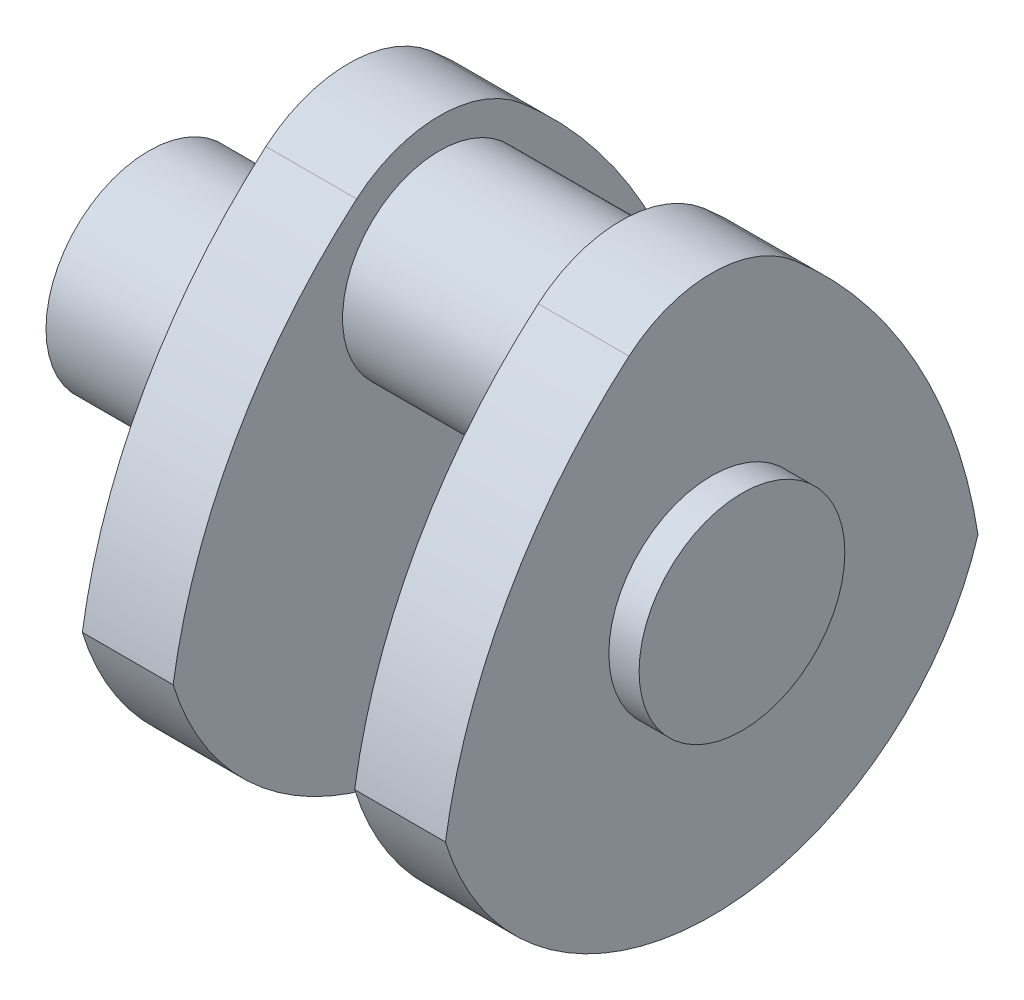
ISO-10303-21;
HEADER;
FILE_DESCRIPTION(('STEP AP214'),'2;1');
FILE_NAME('part.step','',(''),(''),'','','');
FILE_SCHEMA(('AUTOMOTIVE_DESIGN { 1 0 10303 214 1 1 1 1 }'));
ENDSEC;
DATA;
#1=APPLICATION_CONTEXT('core data for automotive mechanical design processes');
#2=APPLICATION_PROTOCOL_DEFINITION('international standard','automotive_design',2000,#1);
#3=PRODUCT_CONTEXT('',#1,'mechanical');
#4=PRODUCT('Part','Part','',(#3));
#5=PRODUCT_RELATED_PRODUCT_CATEGORY('part','',(#4));
#6=PRODUCT_DEFINITION_FORMATION('','',#4);
#7=PRODUCT_DEFINITION_CONTEXT('part definition',#1,'design');
#8=PRODUCT_DEFINITION('design','',#6,#7);
#9=PRODUCT_DEFINITION_SHAPE('','',#8);
#10=(LENGTH_UNIT() NAMED_UNIT(*) SI_UNIT(.MILLI.,.METRE.));
#11=(NAMED_UNIT(*) PLANE_ANGLE_UNIT() SI_UNIT($,.RADIAN.));
#12=(NAMED_UNIT(*) SI_UNIT($,.STERADIAN.) SOLID_ANGLE_UNIT());
#13=UNCERTAINTY_MEASURE_WITH_UNIT(LENGTH_MEASURE(1.E-05),#10,'distance_accuracy_value','');
#14=(GEOMETRIC_REPRESENTATION_CONTEXT(3) GLOBAL_UNCERTAINTY_ASSIGNED_CONTEXT((#13)) GLOBAL_UNIT_ASSIGNED_CONTEXT((#10,
#11,#12)) REPRESENTATION_CONTEXT('',''));
#15=CARTESIAN_POINT('',(0.,0.,0.));
#16=DIRECTION('',(0.,0.,1.));
#17=DIRECTION('',(1.,0.,0.));
#18=AXIS2_PLACEMENT_3D('',#15,#16,#17);
#19=CARTESIAN_POINT('',(-25.,0.,0.));
#20=DIRECTION('',(1.,0.,0.));
#21=DIRECTION('',(0.,0.,-1.));
#22=AXIS2_PLACEMENT_3D('',#19,#20,#21);
#23=CYLINDRICAL_SURFACE('',#22,17.);
#24=CARTESIAN_POINT('',(-25.,0.,0.));
#25=DIRECTION('',(1.,0.,0.));
#26=DIRECTION('',(0.,0.,-1.));
#27=AXIS2_PLACEMENT_3D('',#24,#25,#26);
#28=CIRCLE('',#27,17.);
#29=CARTESIAN_POINT('',(-25.,0.,-17.));
#30=VERTEX_POINT('',#29);
#31=EDGE_CURVE('E55',#30,#30,#28,.T.);
#32=ORIENTED_EDGE('',*,*,#31,.T.);
#33=EDGE_LOOP('',(#32));
#34=FACE_BOUND('',#33,.T.);
#35=CARTESIAN_POINT('',(0.,0.,0.));
#36=DIRECTION('',(1.,0.,0.));
#37=DIRECTION('',(0.,0.,-1.));
#38=AXIS2_PLACEMENT_3D('',#35,#36,#37);
#39=CIRCLE('',#38,17.);
#40=CARTESIAN_POINT('',(0.,0.,-17.));
#41=VERTEX_POINT('',#40);
#42=EDGE_CURVE('E48',#41,#41,#39,.T.);
#43=ORIENTED_EDGE('',*,*,#42,.F.);
#44=EDGE_LOOP('',(#43));
#45=FACE_BOUND('',#44,.T.);
#46=ADVANCED_FACE('F45',(#34,#45),#23,.T.);
#47=CARTESIAN_POINT('',(-25.,0.,0.));
#48=DIRECTION('',(1.,0.,0.));
#49=DIRECTION('',(0.,0.,-1.));
#50=AXIS2_PLACEMENT_3D('',#47,#48,#49);
#51=PLANE('',#50);
#52=ORIENTED_EDGE('',*,*,#31,.F.);
#53=EDGE_LOOP('',(#52));
#54=FACE_BOUND('',#53,.T.);
#55=ADVANCED_FACE('F239',(#54),#51,.F.);
#56=CARTESIAN_POINT('',(8.,0.,0.));
#57=DIRECTION('',(-1.,0.,0.));
#58=DIRECTION('',(0.,0.,1.));
#59=AXIS2_PLACEMENT_3D('',#56,#57,#58);
#60=CYLINDRICAL_SURFACE('',#59,19.);
#61=CARTESIAN_POINT('',(8.,0.,0.));
#62=DIRECTION('',(1.,0.,0.));
#63=DIRECTION('',(0.,0.,-1.));
#64=AXIS2_PLACEMENT_3D('',#61,#62,#63);
#65=CIRCLE('',#64,19.);
#66=CARTESIAN_POINT('',(8.,0.,-19.));
#67=VERTEX_POINT('',#66);
#68=EDGE_CURVE('E221',#67,#67,#65,.T.);
#69=ORIENTED_EDGE('',*,*,#68,.F.);
#70=EDGE_LOOP('',(#69));
#71=FACE_BOUND('',#70,.T.);
#72=CARTESIAN_POINT('',(0.,0.,0.));
#73=DIRECTION('',(1.,0.,0.));
#74=DIRECTION('',(0.,0.,-1.));
#75=AXIS2_PLACEMENT_3D('',#72,#73,#74);
#76=CIRCLE('',#75,19.);
#77=CARTESIAN_POINT('',(0.,0.,-19.));
#78=VERTEX_POINT('',#77);
#79=EDGE_CURVE('E220',#78,#78,#76,.T.);
#80=ORIENTED_EDGE('',*,*,#79,.T.);
#81=EDGE_LOOP('',(#80));
#82=FACE_BOUND('',#81,.T.);
#83=ADVANCED_FACE('F243',(#71,#82),#60,.T.);
#84=CARTESIAN_POINT('',(0.,0.,0.));
#85=DIRECTION('',(1.,0.,0.));
#86=DIRECTION('',(0.,0.,-1.));
#87=AXIS2_PLACEMENT_3D('',#84,#85,#86);
#88=PLANE('',#87);
#89=ORIENTED_EDGE('',*,*,#42,.T.);
#90=EDGE_LOOP('',(#89));
#91=FACE_BOUND('',#90,.T.);
#92=ORIENTED_EDGE('',*,*,#79,.F.);
#93=EDGE_LOOP('',(#92));
#94=FACE_BOUND('',#93,.T.);
#95=ADVANCED_FACE('F235',(#91,#94),#88,.F.);
#96=CARTESIAN_POINT('',(23.,-27.3845485151599,-44.9094542035734));
#97=DIRECTION('',(-1.,0.,0.));
#98=DIRECTION('',(0.,0.,1.));
#99=AXIS2_PLACEMENT_3D('',#96,#97,#98);
#100=CYLINDRICAL_SURFACE('',#99,90.);
#101=CARTESIAN_POINT('',(8.,-27.3845485151599,-44.9094542035734));
#102=DIRECTION('',(1.,0.,0.));
#103=DIRECTION('',(0.,0.,-1.));
#104=AXIS2_PLACEMENT_3D('',#101,#102,#103);
#105=CIRCLE('',#104,90.);
#106=CARTESIAN_POINT('',(8.,40.9431234611356,13.6680947576093));
#107=VERTEX_POINT('',#106);
#108=CARTESIAN_POINT('',(8.,-13.4164078649987,44.));
#109=VERTEX_POINT('',#108);
#110=EDGE_CURVE('E187',#107,#109,#105,.T.);
#111=ORIENTED_EDGE('',*,*,#110,.T.);
#112=DIRECTION('',(-1.,0.,0.));
#113=VECTOR('',#112,1.);
#114=CARTESIAN_POINT('',(23.,-13.4164078649987,44.));
#115=LINE('',#114,#113);
#116=CARTESIAN_POINT('',(23.,-13.4164078649987,44.));
#117=VERTEX_POINT('',#116);
#118=EDGE_CURVE('E217',#117,#109,#115,.T.);
#119=ORIENTED_EDGE('',*,*,#118,.F.);
#120=CARTESIAN_POINT('',(23.,-27.3845485151599,-44.9094542035734));
#121=DIRECTION('',(1.,0.,0.));
#122=DIRECTION('',(0.,0.,-1.));
#123=AXIS2_PLACEMENT_3D('',#120,#121,#122);
#124=CIRCLE('',#123,90.);
#125=CARTESIAN_POINT('',(23.,40.9431234611356,13.6680947576093));
#126=VERTEX_POINT('',#125);
#127=EDGE_CURVE('E188',#126,#117,#124,.T.);
#128=ORIENTED_EDGE('',*,*,#127,.F.);
#129=DIRECTION('',(-1.,0.,0.));
#130=VECTOR('',#129,1.);
#131=CARTESIAN_POINT('',(23.,40.9431234611356,13.6680947576093));
#132=LINE('',#131,#130);
#133=EDGE_CURVE('E198',#126,#107,#132,.T.);
#134=ORIENTED_EDGE('',*,*,#133,.T.);
#135=EDGE_LOOP('',(#111,#119,#128,#134));
#136=FACE_BOUND('',#135,.T.);
#137=ADVANCED_FACE('F253',(#136),#100,.T.);
#138=CARTESIAN_POINT('',(23.,0.,0.));
#139=DIRECTION('',(-1.,0.,0.));
#140=DIRECTION('',(0.,0.,1.));
#141=AXIS2_PLACEMENT_3D('',#138,#139,#140);
#142=CYLINDRICAL_SURFACE('',#141,46.);
#143=CARTESIAN_POINT('',(8.,0.,0.));
#144=DIRECTION('',(1.,0.,0.));
#145=DIRECTION('',(0.,0.,1.));
#146=AXIS2_PLACEMENT_3D('',#143,#144,#145);
#147=CIRCLE('',#146,46.);
#148=CARTESIAN_POINT('',(8.,-13.4164078649987,-44.));
#149=VERTEX_POINT('',#148);
#150=EDGE_CURVE('E202',#109,#149,#147,.T.);
#151=ORIENTED_EDGE('',*,*,#150,.T.);
#152=DIRECTION('',(-1.,0.,0.));
#153=VECTOR('',#152,1.);
#154=CARTESIAN_POINT('',(23.,-13.4164078649987,-44.));
#155=LINE('',#154,#153);
#156=CARTESIAN_POINT('',(23.,-13.4164078649987,-44.));
#157=VERTEX_POINT('',#156);
#158=EDGE_CURVE('E214',#157,#149,#155,.T.);
#159=ORIENTED_EDGE('',*,*,#158,.F.);
#160=CARTESIAN_POINT('',(23.,0.,0.));
#161=DIRECTION('',(1.,0.,0.));
#162=DIRECTION('',(0.,0.,1.));
#163=AXIS2_PLACEMENT_3D('',#160,#161,#162);
#164=CIRCLE('',#163,46.);
#165=EDGE_CURVE('E96',#117,#157,#164,.T.);
#166=ORIENTED_EDGE('',*,*,#165,.F.);
#167=ORIENTED_EDGE('',*,*,#118,.T.);
#168=EDGE_LOOP('',(#151,#159,#166,#167));
#169=FACE_BOUND('',#168,.T.);
#170=ADVANCED_FACE('F256',(#169),#142,.T.);
#171=CARTESIAN_POINT('',(23.,-27.3845485151599,44.9094542035734));
#172=DIRECTION('',(-1.,0.,0.));
#173=DIRECTION('',(0.,0.,1.));
#174=AXIS2_PLACEMENT_3D('',#171,#172,#173);
#175=CYLINDRICAL_SURFACE('',#174,90.);
#176=CARTESIAN_POINT('',(8.,-27.3845485151599,44.9094542035734));
#177=DIRECTION('',(1.,0.,0.));
#178=DIRECTION('',(0.,0.,1.));
#179=AXIS2_PLACEMENT_3D('',#176,#177,#178);
#180=CIRCLE('',#179,90.);
#181=CARTESIAN_POINT('',(8.,40.9431234611356,-13.6680947576093));
#182=VERTEX_POINT('',#181);
#183=EDGE_CURVE('E82',#149,#182,#180,.T.);
#184=ORIENTED_EDGE('',*,*,#183,.T.);
#185=DIRECTION('',(-1.,0.,0.));
#186=VECTOR('',#185,1.);
#187=CARTESIAN_POINT('',(23.,40.9431234611356,-13.6680947576093));
#188=LINE('',#187,#186);
#189=CARTESIAN_POINT('',(23.,40.9431234611356,-13.6680947576093));
#190=VERTEX_POINT('',#189);
#191=EDGE_CURVE('E211',#190,#182,#188,.T.);
#192=ORIENTED_EDGE('',*,*,#191,.F.);
#193=CARTESIAN_POINT('',(23.,-27.3845485151599,44.9094542035734));
#194=DIRECTION('',(1.,0.,0.));
#195=DIRECTION('',(0.,0.,1.));
#196=AXIS2_PLACEMENT_3D('',#193,#194,#195);
#197=CIRCLE('',#196,90.);
#198=EDGE_CURVE('E193',#157,#190,#197,.T.);
#199=ORIENTED_EDGE('',*,*,#198,.F.);
#200=ORIENTED_EDGE('',*,*,#158,.T.);
#201=EDGE_LOOP('',(#184,#192,#199,#200));
#202=FACE_BOUND('',#201,.T.);
#203=ADVANCED_FACE('F260',(#202),#175,.T.);
#204=CARTESIAN_POINT('',(23.,25.,0.));
#205=DIRECTION('',(-1.,0.,0.));
#206=DIRECTION('',(0.,0.,1.));
#207=AXIS2_PLACEMENT_3D('',#204,#205,#206);
#208=CYLINDRICAL_SURFACE('',#207,21.);
#209=CARTESIAN_POINT('',(8.,25.,0.));
#210=DIRECTION('',(1.,0.,0.));
#211=DIRECTION('',(0.,0.,1.));
#212=AXIS2_PLACEMENT_3D('',#209,#210,#211);
#213=CIRCLE('',#212,21.);
#214=EDGE_CURVE('E88',#182,#107,#213,.T.);
#215=ORIENTED_EDGE('',*,*,#214,.T.);
#216=ORIENTED_EDGE('',*,*,#133,.F.);
#217=CARTESIAN_POINT('',(23.,25.,0.));
#218=DIRECTION('',(1.,0.,0.));
#219=DIRECTION('',(0.,0.,1.));
#220=AXIS2_PLACEMENT_3D('',#217,#218,#219);
#221=CIRCLE('',#220,21.);
#222=EDGE_CURVE('E64',#190,#126,#221,.T.);
#223=ORIENTED_EDGE('',*,*,#222,.F.);
#224=ORIENTED_EDGE('',*,*,#191,.T.);
#225=EDGE_LOOP('',(#215,#216,#223,#224));
#226=FACE_BOUND('',#225,.T.);
#227=ADVANCED_FACE('F263',(#226),#208,.T.);
#228=CARTESIAN_POINT('',(23.,-13.6922742575799,-22.4547271017867));
#229=DIRECTION('',(1.,0.,0.));
#230=DIRECTION('',(0.,0.,-1.));
#231=AXIS2_PLACEMENT_3D('',#228,#229,#230);
#232=PLANE('',#231);
#233=CARTESIAN_POINT('',(23.,25.,0.));
#234=DIRECTION('',(1.,0.,0.));
#235=DIRECTION('',(0.,0.,-1.));
#236=AXIS2_PLACEMENT_3D('',#233,#234,#235);
#237=CIRCLE('',#236,16.);
#238=CARTESIAN_POINT('',(23.,25.,-16.));
#239=VERTEX_POINT('',#238);
#240=EDGE_CURVE('E145',#239,#239,#237,.T.);
#241=ORIENTED_EDGE('',*,*,#240,.F.);
#242=EDGE_LOOP('',(#241));
#243=FACE_BOUND('',#242,.T.);
#244=ORIENTED_EDGE('',*,*,#127,.T.);
#245=ORIENTED_EDGE('',*,*,#165,.T.);
#246=ORIENTED_EDGE('',*,*,#198,.T.);
#247=ORIENTED_EDGE('',*,*,#222,.T.);
#248=EDGE_LOOP('',(#244,#245,#246,#247));
#249=FACE_BOUND('',#248,.T.);
#250=ADVANCED_FACE('F266',(#243,#249),#232,.T.);
#251=CARTESIAN_POINT('',(8.,-13.6922742575799,-22.4547271017867));
#252=DIRECTION('',(1.,0.,0.));
#253=DIRECTION('',(0.,0.,-1.));
#254=AXIS2_PLACEMENT_3D('',#251,#252,#253);
#255=PLANE('',#254);
#256=ORIENTED_EDGE('',*,*,#68,.T.);
#257=EDGE_LOOP('',(#256));
#258=FACE_BOUND('',#257,.T.);
#259=ORIENTED_EDGE('',*,*,#110,.F.);
#260=ORIENTED_EDGE('',*,*,#214,.F.);
#261=ORIENTED_EDGE('',*,*,#183,.F.);
#262=ORIENTED_EDGE('',*,*,#150,.F.);
#263=EDGE_LOOP('',(#259,#260,#261,#262));
#264=FACE_BOUND('',#263,.T.);
#265=ADVANCED_FACE('F267',(#258,#264),#255,.F.);
#266=CARTESIAN_POINT('',(38.,25.,0.));
#267=DIRECTION('',(-1.,0.,0.));
#268=DIRECTION('',(0.,0.,1.));
#269=AXIS2_PLACEMENT_3D('',#266,#267,#268);
#270=CYLINDRICAL_SURFACE('',#269,16.);
#271=ORIENTED_EDGE('',*,*,#240,.T.);
#272=EDGE_LOOP('',(#271));
#273=FACE_BOUND('',#272,.T.);
#274=CARTESIAN_POINT('',(53.,25.,0.));
#275=DIRECTION('',(1.,0.,0.));
#276=DIRECTION('',(0.,0.,-1.));
#277=AXIS2_PLACEMENT_3D('',#274,#275,#276);
#278=CIRCLE('',#277,16.);
#279=CARTESIAN_POINT('',(53.,25.,-16.));
#280=VERTEX_POINT('',#279);
#281=EDGE_CURVE('E152',#280,#280,#278,.T.);
#282=ORIENTED_EDGE('',*,*,#281,.F.);
#283=EDGE_LOOP('',(#282));
#284=FACE_BOUND('',#283,.T.);
#285=ADVANCED_FACE('F270',(#273,#284),#270,.T.);
#286=CARTESIAN_POINT('',(53.,-27.3845485151599,-44.9094542035734));
#287=DIRECTION('',(1.,0.,0.));
#288=DIRECTION('',(0.,0.,1.));
#289=AXIS2_PLACEMENT_3D('',#286,#287,#288);
#290=CYLINDRICAL_SURFACE('',#289,90.);
#291=CARTESIAN_POINT('',(68.,-27.3845485151599,-44.9094542035734));
#292=DIRECTION('',(1.,0.,0.));
#293=DIRECTION('',(0.,0.,-1.));
#294=AXIS2_PLACEMENT_3D('',#291,#292,#293);
#295=CIRCLE('',#294,90.);
#296=CARTESIAN_POINT('',(68.,40.9431234611356,13.6680947576093));
#297=VERTEX_POINT('',#296);
#298=CARTESIAN_POINT('',(68.,-13.4164078649987,44.));
#299=VERTEX_POINT('',#298);
#300=EDGE_CURVE('E173',#297,#299,#295,.T.);
#301=ORIENTED_EDGE('',*,*,#300,.F.);
#302=DIRECTION('',(1.,0.,0.));
#303=VECTOR('',#302,1.);
#304=CARTESIAN_POINT('',(53.,40.9431234611356,13.6680947576093));
#305=LINE('',#304,#303);
#306=CARTESIAN_POINT('',(53.,40.9431234611356,13.6680947576093));
#307=VERTEX_POINT('',#306);
#308=EDGE_CURVE('E150',#307,#297,#305,.T.);
#309=ORIENTED_EDGE('',*,*,#308,.F.);
#310=CARTESIAN_POINT('',(53.,-27.3845485151599,-44.9094542035734));
#311=DIRECTION('',(1.,0.,0.));
#312=DIRECTION('',(0.,0.,-1.));
#313=AXIS2_PLACEMENT_3D('',#310,#311,#312);
#314=CIRCLE('',#313,90.);
#315=CARTESIAN_POINT('',(53.,-13.4164078649987,44.));
#316=VERTEX_POINT('',#315);
#317=EDGE_CURVE('E127',#307,#316,#314,.T.);
#318=ORIENTED_EDGE('',*,*,#317,.T.);
#319=DIRECTION('',(1.,0.,0.));
#320=VECTOR('',#319,1.);
#321=CARTESIAN_POINT('',(53.,-13.4164078649987,44.));
#322=LINE('',#321,#320);
#323=EDGE_CURVE('E137',#316,#299,#322,.T.);
#324=ORIENTED_EDGE('',*,*,#323,.T.);
#325=EDGE_LOOP('',(#301,#309,#318,#324));
#326=FACE_BOUND('',#325,.T.);
#327=ADVANCED_FACE('F148',(#326),#290,.T.);
#328=CARTESIAN_POINT('',(53.,0.,0.));
#329=DIRECTION('',(1.,0.,0.));
#330=DIRECTION('',(0.,0.,1.));
#331=AXIS2_PLACEMENT_3D('',#328,#329,#330);
#332=CYLINDRICAL_SURFACE('',#331,46.);
#333=CARTESIAN_POINT('',(68.,0.,0.));
#334=DIRECTION('',(1.,0.,0.));
#335=DIRECTION('',(0.,0.,1.));
#336=AXIS2_PLACEMENT_3D('',#333,#334,#335);
#337=CIRCLE('',#336,46.);
#338=CARTESIAN_POINT('',(68.,-13.4164078649987,-44.));
#339=VERTEX_POINT('',#338);
#340=EDGE_CURVE('E140',#299,#339,#337,.T.);
#341=ORIENTED_EDGE('',*,*,#340,.F.);
#342=ORIENTED_EDGE('',*,*,#323,.F.);
#343=CARTESIAN_POINT('',(53.,0.,0.));
#344=DIRECTION('',(1.,0.,0.));
#345=DIRECTION('',(0.,0.,1.));
#346=AXIS2_PLACEMENT_3D('',#343,#344,#345);
#347=CIRCLE('',#346,46.);
#348=CARTESIAN_POINT('',(53.,-13.4164078649987,-44.));
#349=VERTEX_POINT('',#348);
#350=EDGE_CURVE('E123',#316,#349,#347,.T.);
#351=ORIENTED_EDGE('',*,*,#350,.T.);
#352=DIRECTION('',(1.,0.,0.));
#353=VECTOR('',#352,1.);
#354=CARTESIAN_POINT('',(53.,-13.4164078649987,-44.));
#355=LINE('',#354,#353);
#356=EDGE_CURVE('E146',#349,#339,#355,.T.);
#357=ORIENTED_EDGE('',*,*,#356,.T.);
#358=EDGE_LOOP('',(#341,#342,#351,#357));
#359=FACE_BOUND('',#358,.T.);
#360=ADVANCED_FACE('F138',(#359),#332,.T.);
#361=CARTESIAN_POINT('',(53.,-27.3845485151599,44.9094542035734));
#362=DIRECTION('',(1.,0.,0.));
#363=DIRECTION('',(0.,0.,1.));
#364=AXIS2_PLACEMENT_3D('',#361,#362,#363);
#365=CYLINDRICAL_SURFACE('',#364,90.);
#366=CARTESIAN_POINT('',(68.,-27.3845485151599,44.9094542035734));
#367=DIRECTION('',(1.,0.,0.));
#368=DIRECTION('',(0.,0.,1.));
#369=AXIS2_PLACEMENT_3D('',#366,#367,#368);
#370=CIRCLE('',#369,90.);
#371=CARTESIAN_POINT('',(68.,40.9431234611356,-13.6680947576093));
#372=VERTEX_POINT('',#371);
#373=EDGE_CURVE('E176',#339,#372,#370,.T.);
#374=ORIENTED_EDGE('',*,*,#373,.F.);
#375=ORIENTED_EDGE('',*,*,#356,.F.);
#376=CARTESIAN_POINT('',(53.,-27.3845485151599,44.9094542035734));
#377=DIRECTION('',(1.,0.,0.));
#378=DIRECTION('',(0.,0.,1.));
#379=AXIS2_PLACEMENT_3D('',#376,#377,#378);
#380=CIRCLE('',#379,90.);
#381=CARTESIAN_POINT('',(53.,40.9431234611356,-13.6680947576093));
#382=VERTEX_POINT('',#381);
#383=EDGE_CURVE('E130',#349,#382,#380,.T.);
#384=ORIENTED_EDGE('',*,*,#383,.T.);
#385=DIRECTION('',(1.,0.,0.));
#386=VECTOR('',#385,1.);
#387=CARTESIAN_POINT('',(53.,40.9431234611356,-13.6680947576093));
#388=LINE('',#387,#386);
#389=EDGE_CURVE('E169',#382,#372,#388,.T.);
#390=ORIENTED_EDGE('',*,*,#389,.T.);
#391=EDGE_LOOP('',(#374,#375,#384,#390));
#392=FACE_BOUND('',#391,.T.);
#393=ADVANCED_FACE('F282',(#392),#365,.T.);
#394=CARTESIAN_POINT('',(68.,-13.6922742575799,-22.4547271017867));
#395=DIRECTION('',(-1.,0.,0.));
#396=DIRECTION('',(0.,0.,-1.));
#397=AXIS2_PLACEMENT_3D('',#394,#395,#396);
#398=PLANE('',#397);
#399=CARTESIAN_POINT('',(68.,0.,0.));
#400=DIRECTION('',(1.,0.,0.));
#401=DIRECTION('',(0.,0.,-1.));
#402=AXIS2_PLACEMENT_3D('',#399,#400,#401);
#403=CIRCLE('',#402,17.);
#404=CARTESIAN_POINT('',(68.,0.,-17.));
#405=VERTEX_POINT('',#404);
#406=EDGE_CURVE('E11',#405,#405,#403,.T.);
#407=ORIENTED_EDGE('',*,*,#406,.F.);
#408=EDGE_LOOP('',(#407));
#409=FACE_BOUND('',#408,.T.);
#410=ORIENTED_EDGE('',*,*,#300,.T.);
#411=ORIENTED_EDGE('',*,*,#340,.T.);
#412=ORIENTED_EDGE('',*,*,#373,.T.);
#413=CARTESIAN_POINT('',(68.,25.,0.));
#414=DIRECTION('',(1.,0.,0.));
#415=DIRECTION('',(0.,0.,1.));
#416=AXIS2_PLACEMENT_3D('',#413,#414,#415);
#417=CIRCLE('',#416,21.);
#418=EDGE_CURVE('E164',#372,#297,#417,.T.);
#419=ORIENTED_EDGE('',*,*,#418,.T.);
#420=EDGE_LOOP('',(#410,#411,#412,#419));
#421=FACE_BOUND('',#420,.T.);
#422=ADVANCED_FACE('F285',(#409,#421),#398,.F.);
#423=CARTESIAN_POINT('',(53.,25.,0.));
#424=DIRECTION('',(1.,0.,0.));
#425=DIRECTION('',(0.,0.,1.));
#426=AXIS2_PLACEMENT_3D('',#423,#424,#425);
#427=CYLINDRICAL_SURFACE('',#426,21.);
#428=ORIENTED_EDGE('',*,*,#418,.F.);
#429=ORIENTED_EDGE('',*,*,#389,.F.);
#430=CARTESIAN_POINT('',(53.,25.,0.));
#431=DIRECTION('',(1.,0.,0.));
#432=DIRECTION('',(0.,0.,1.));
#433=AXIS2_PLACEMENT_3D('',#430,#431,#432);
#434=CIRCLE('',#433,21.);
#435=EDGE_CURVE('E161',#382,#307,#434,.T.);
#436=ORIENTED_EDGE('',*,*,#435,.T.);
#437=ORIENTED_EDGE('',*,*,#308,.T.);
#438=EDGE_LOOP('',(#428,#429,#436,#437));
#439=FACE_BOUND('',#438,.T.);
#440=ADVANCED_FACE('F289',(#439),#427,.T.);
#441=CARTESIAN_POINT('',(53.,-13.6922742575799,-22.4547271017867));
#442=DIRECTION('',(-1.,0.,0.));
#443=DIRECTION('',(0.,0.,-1.));
#444=AXIS2_PLACEMENT_3D('',#441,#442,#443);
#445=PLANE('',#444);
#446=ORIENTED_EDGE('',*,*,#281,.T.);
#447=EDGE_LOOP('',(#446));
#448=FACE_BOUND('',#447,.T.);
#449=ORIENTED_EDGE('',*,*,#317,.F.);
#450=ORIENTED_EDGE('',*,*,#435,.F.);
#451=ORIENTED_EDGE('',*,*,#383,.F.);
#452=ORIENTED_EDGE('',*,*,#350,.F.);
#453=EDGE_LOOP('',(#449,#450,#451,#452));
#454=FACE_BOUND('',#453,.T.);
#455=ADVANCED_FACE('F125',(#448,#454),#445,.T.);
#456=CARTESIAN_POINT('',(73.,0.,0.));
#457=DIRECTION('',(-1.,0.,0.));
#458=DIRECTION('',(0.,0.,1.));
#459=AXIS2_PLACEMENT_3D('',#456,#457,#458);
#460=CYLINDRICAL_SURFACE('',#459,17.);
#461=CARTESIAN_POINT('',(73.,0.,0.));
#462=DIRECTION('',(1.,0.,0.));
#463=DIRECTION('',(0.,0.,-1.));
#464=AXIS2_PLACEMENT_3D('',#461,#462,#463);
#465=CIRCLE('',#464,17.);
#466=CARTESIAN_POINT('',(73.,0.,-17.));
#467=VERTEX_POINT('',#466);
#468=EDGE_CURVE('E156',#467,#467,#465,.T.);
#469=ORIENTED_EDGE('',*,*,#468,.F.);
#470=EDGE_LOOP('',(#469));
#471=FACE_BOUND('',#470,.T.);
#472=ORIENTED_EDGE('',*,*,#406,.T.);
#473=EDGE_LOOP('',(#472));
#474=FACE_BOUND('',#473,.T.);
#475=ADVANCED_FACE('F296',(#471,#474),#460,.T.);
#476=CARTESIAN_POINT('',(73.,0.,0.));
#477=DIRECTION('',(1.,0.,0.));
#478=DIRECTION('',(0.,0.,-1.));
#479=AXIS2_PLACEMENT_3D('',#476,#477,#478);
#480=PLANE('',#479);
#481=ORIENTED_EDGE('',*,*,#468,.T.);
#482=EDGE_LOOP('',(#481));
#483=FACE_BOUND('',#482,.T.);
#484=ADVANCED_FACE('F300',(#483),#480,.T.);
#485=CLOSED_SHELL('',(#46,#55,#83,#95,#137,#170,#203,#227,#250,#265,#285,#327,#360,#393,#422,
#440,#455,#475,#484));
#486=MANIFOLD_SOLID_BREP('B2',#485);
#487=ADVANCED_BREP_SHAPE_REPRESENTATION('',(#18,#486),#14);
#488=SHAPE_DEFINITION_REPRESENTATION(#9,#487);
ENDSEC;
END-ISO-10303-21;
